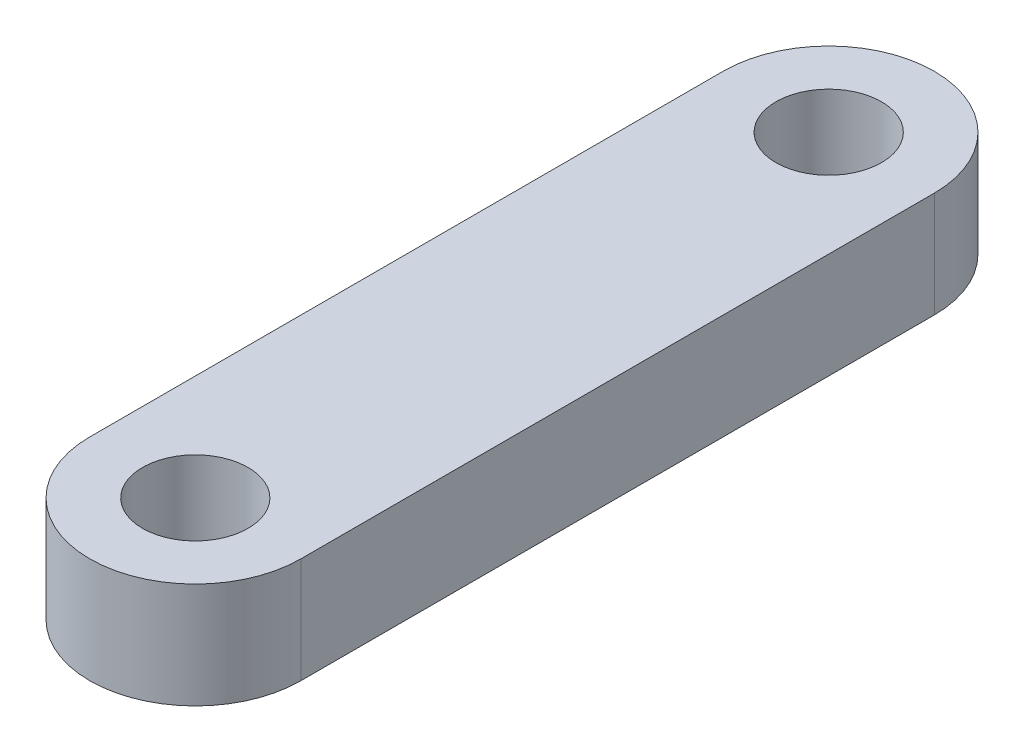
ISO-10303-21;
HEADER;
FILE_DESCRIPTION(('STEP AP214'),'2;1');
FILE_NAME('part.step','',(''),(''),'','','');
FILE_SCHEMA(('AUTOMOTIVE_DESIGN { 1 0 10303 214 1 1 1 1 }'));
ENDSEC;
DATA;
#1=APPLICATION_CONTEXT('core data for automotive mechanical design processes');
#2=APPLICATION_PROTOCOL_DEFINITION('international standard','automotive_design',2000,#1);
#3=PRODUCT_CONTEXT('',#1,'mechanical');
#4=PRODUCT('Part','Part','',(#3));
#5=PRODUCT_RELATED_PRODUCT_CATEGORY('part','',(#4));
#6=PRODUCT_DEFINITION_FORMATION('','',#4);
#7=PRODUCT_DEFINITION_CONTEXT('part definition',#1,'design');
#8=PRODUCT_DEFINITION('design','',#6,#7);
#9=PRODUCT_DEFINITION_SHAPE('','',#8);
#10=(LENGTH_UNIT() NAMED_UNIT(*) SI_UNIT(.MILLI.,.METRE.));
#11=(NAMED_UNIT(*) PLANE_ANGLE_UNIT() SI_UNIT($,.RADIAN.));
#12=(NAMED_UNIT(*) SI_UNIT($,.STERADIAN.) SOLID_ANGLE_UNIT());
#13=UNCERTAINTY_MEASURE_WITH_UNIT(LENGTH_MEASURE(1.E-05),#10,'distance_accuracy_value','');
#14=(GEOMETRIC_REPRESENTATION_CONTEXT(3) GLOBAL_UNCERTAINTY_ASSIGNED_CONTEXT((#13)) GLOBAL_UNIT_ASSIGNED_CONTEXT((#10,
#11,#12)) REPRESENTATION_CONTEXT('',''));
#15=CARTESIAN_POINT('',(0.,0.,0.));
#16=DIRECTION('',(0.,0.,1.));
#17=DIRECTION('',(1.,0.,0.));
#18=AXIS2_PLACEMENT_3D('',#15,#16,#17);
#19=CARTESIAN_POINT('',(0.,3.175,0.));
#20=DIRECTION('',(0.,1.,0.));
#21=DIRECTION('',(0.,0.,1.));
#22=AXIS2_PLACEMENT_3D('',#19,#20,#21);
#23=PLANE('',#22);
#24=CARTESIAN_POINT('',(0.,3.175,-19.05));
#25=DIRECTION('',(0.,1.,0.));
#26=DIRECTION('',(0.,0.,1.));
#27=AXIS2_PLACEMENT_3D('',#24,#25,#26);
#28=CIRCLE('',#27,1.5875);
#29=CARTESIAN_POINT('',(0.,3.175,-17.4625));
#30=VERTEX_POINT('',#29);
#31=EDGE_CURVE('E100',#30,#30,#28,.T.);
#32=ORIENTED_EDGE('',*,*,#31,.F.);
#33=EDGE_LOOP('',(#32));
#34=FACE_BOUND('',#33,.T.);
#35=CARTESIAN_POINT('',(0.,3.175,0.));
#36=DIRECTION('',(0.,1.,0.));
#37=DIRECTION('',(0.,0.,1.));
#38=AXIS2_PLACEMENT_3D('',#35,#36,#37);
#39=CIRCLE('',#38,3.175);
#40=CARTESIAN_POINT('',(-3.175,3.175,0.));
#41=VERTEX_POINT('',#40);
#42=CARTESIAN_POINT('',(3.175,3.175,0.));
#43=VERTEX_POINT('',#42);
#44=EDGE_CURVE('E85',#41,#43,#39,.T.);
#45=ORIENTED_EDGE('',*,*,#44,.T.);
#46=DIRECTION('',(0.,0.,-1.));
#47=VECTOR('',#46,1.);
#48=CARTESIAN_POINT('',(3.175,3.175,0.));
#49=LINE('',#48,#47);
#50=CARTESIAN_POINT('',(3.175,3.175,-19.05));
#51=VERTEX_POINT('',#50);
#52=EDGE_CURVE('E80',#43,#51,#49,.T.);
#53=ORIENTED_EDGE('',*,*,#52,.T.);
#54=CARTESIAN_POINT('',(0.,3.175,-19.05));
#55=DIRECTION('',(0.,1.,0.));
#56=DIRECTION('',(0.,0.,1.));
#57=AXIS2_PLACEMENT_3D('',#54,#55,#56);
#58=CIRCLE('',#57,3.175);
#59=CARTESIAN_POINT('',(-3.175,3.175,-19.05));
#60=VERTEX_POINT('',#59);
#61=EDGE_CURVE('E83',#51,#60,#58,.T.);
#62=ORIENTED_EDGE('',*,*,#61,.T.);
#63=DIRECTION('',(0.,0.,1.));
#64=VECTOR('',#63,1.);
#65=CARTESIAN_POINT('',(-3.175,3.175,0.));
#66=LINE('',#65,#64);
#67=EDGE_CURVE('E50',#60,#41,#66,.T.);
#68=ORIENTED_EDGE('',*,*,#67,.T.);
#69=EDGE_LOOP('',(#45,#53,#62,#68));
#70=FACE_BOUND('',#69,.T.);
#71=CARTESIAN_POINT('',(0.,3.175,0.));
#72=DIRECTION('',(0.,1.,0.));
#73=DIRECTION('',(0.,0.,1.));
#74=AXIS2_PLACEMENT_3D('',#71,#72,#73);
#75=CIRCLE('',#74,1.5875);
#76=CARTESIAN_POINT('',(0.,3.175,1.5875));
#77=VERTEX_POINT('',#76);
#78=EDGE_CURVE('E115',#77,#77,#75,.T.);
#79=ORIENTED_EDGE('',*,*,#78,.F.);
#80=EDGE_LOOP('',(#79));
#81=FACE_BOUND('',#80,.T.);
#82=ADVANCED_FACE('F33',(#34,#70,#81),#23,.T.);
#83=CARTESIAN_POINT('',(0.,0.,0.));
#84=DIRECTION('',(0.,1.,0.));
#85=DIRECTION('',(0.,0.,1.));
#86=AXIS2_PLACEMENT_3D('',#83,#84,#85);
#87=PLANE('',#86);
#88=CARTESIAN_POINT('',(0.,0.,-19.05));
#89=DIRECTION('',(0.,1.,0.));
#90=DIRECTION('',(0.,0.,1.));
#91=AXIS2_PLACEMENT_3D('',#88,#89,#90);
#92=CIRCLE('',#91,1.5875);
#93=CARTESIAN_POINT('',(0.,0.,-17.4625));
#94=VERTEX_POINT('',#93);
#95=EDGE_CURVE('E112',#94,#94,#92,.T.);
#96=ORIENTED_EDGE('',*,*,#95,.T.);
#97=EDGE_LOOP('',(#96));
#98=FACE_BOUND('',#97,.T.);
#99=CARTESIAN_POINT('',(0.,0.,0.));
#100=DIRECTION('',(0.,1.,0.));
#101=DIRECTION('',(0.,0.,1.));
#102=AXIS2_PLACEMENT_3D('',#99,#100,#101);
#103=CIRCLE('',#102,3.175);
#104=CARTESIAN_POINT('',(-3.175,0.,0.));
#105=VERTEX_POINT('',#104);
#106=CARTESIAN_POINT('',(3.175,0.,0.));
#107=VERTEX_POINT('',#106);
#108=EDGE_CURVE('E97',#105,#107,#103,.T.);
#109=ORIENTED_EDGE('',*,*,#108,.F.);
#110=DIRECTION('',(0.,0.,1.));
#111=VECTOR('',#110,1.);
#112=CARTESIAN_POINT('',(-3.175,0.,0.));
#113=LINE('',#112,#111);
#114=CARTESIAN_POINT('',(-3.175,0.,-19.05));
#115=VERTEX_POINT('',#114);
#116=EDGE_CURVE('E73',#115,#105,#113,.T.);
#117=ORIENTED_EDGE('',*,*,#116,.F.);
#118=CARTESIAN_POINT('',(0.,0.,-19.05));
#119=DIRECTION('',(0.,1.,0.));
#120=DIRECTION('',(0.,0.,1.));
#121=AXIS2_PLACEMENT_3D('',#118,#119,#120);
#122=CIRCLE('',#121,3.175);
#123=CARTESIAN_POINT('',(3.175,0.,-19.05));
#124=VERTEX_POINT('',#123);
#125=EDGE_CURVE('E67',#124,#115,#122,.T.);
#126=ORIENTED_EDGE('',*,*,#125,.F.);
#127=DIRECTION('',(0.,0.,-1.));
#128=VECTOR('',#127,1.);
#129=CARTESIAN_POINT('',(3.175,0.,0.));
#130=LINE('',#129,#128);
#131=EDGE_CURVE('E89',#107,#124,#130,.T.);
#132=ORIENTED_EDGE('',*,*,#131,.F.);
#133=EDGE_LOOP('',(#109,#117,#126,#132));
#134=FACE_BOUND('',#133,.T.);
#135=CARTESIAN_POINT('',(0.,0.,0.));
#136=DIRECTION('',(0.,1.,0.));
#137=DIRECTION('',(0.,0.,1.));
#138=AXIS2_PLACEMENT_3D('',#135,#136,#137);
#139=CIRCLE('',#138,1.5875);
#140=CARTESIAN_POINT('',(0.,0.,1.5875));
#141=VERTEX_POINT('',#140);
#142=EDGE_CURVE('E118',#141,#141,#139,.T.);
#143=ORIENTED_EDGE('',*,*,#142,.T.);
#144=EDGE_LOOP('',(#143));
#145=FACE_BOUND('',#144,.T.);
#146=ADVANCED_FACE('F108',(#98,#134,#145),#87,.F.);
#147=CARTESIAN_POINT('',(0.,3.175,0.));
#148=DIRECTION('',(0.,-1.,0.));
#149=DIRECTION('',(0.,0.,-1.));
#150=AXIS2_PLACEMENT_3D('',#147,#148,#149);
#151=CYLINDRICAL_SURFACE('',#150,3.175);
#152=ORIENTED_EDGE('',*,*,#108,.T.);
#153=DIRECTION('',(0.,-1.,0.));
#154=VECTOR('',#153,1.);
#155=CARTESIAN_POINT('',(3.175,3.175,0.));
#156=LINE('',#155,#154);
#157=EDGE_CURVE('E11',#43,#107,#156,.T.);
#158=ORIENTED_EDGE('',*,*,#157,.F.);
#159=ORIENTED_EDGE('',*,*,#44,.F.);
#160=DIRECTION('',(0.,-1.,0.));
#161=VECTOR('',#160,1.);
#162=CARTESIAN_POINT('',(-3.175,3.175,0.));
#163=LINE('',#162,#161);
#164=EDGE_CURVE('E93',#41,#105,#163,.T.);
#165=ORIENTED_EDGE('',*,*,#164,.T.);
#166=EDGE_LOOP('',(#152,#158,#159,#165));
#167=FACE_BOUND('',#166,.T.);
#168=ADVANCED_FACE('F35',(#167),#151,.T.);
#169=CARTESIAN_POINT('',(3.175,3.175,0.));
#170=DIRECTION('',(-1.,0.,0.));
#171=DIRECTION('',(0.,0.,1.));
#172=AXIS2_PLACEMENT_3D('',#169,#170,#171);
#173=PLANE('',#172);
#174=ORIENTED_EDGE('',*,*,#131,.T.);
#175=DIRECTION('',(0.,-1.,0.));
#176=VECTOR('',#175,1.);
#177=CARTESIAN_POINT('',(3.175,3.175,-19.05));
#178=LINE('',#177,#176);
#179=EDGE_CURVE('E42',#51,#124,#178,.T.);
#180=ORIENTED_EDGE('',*,*,#179,.F.);
#181=ORIENTED_EDGE('',*,*,#52,.F.);
#182=ORIENTED_EDGE('',*,*,#157,.T.);
#183=EDGE_LOOP('',(#174,#180,#181,#182));
#184=FACE_BOUND('',#183,.T.);
#185=ADVANCED_FACE('F88',(#184),#173,.F.);
#186=CARTESIAN_POINT('',(0.,3.175,-19.05));
#187=DIRECTION('',(0.,-1.,0.));
#188=DIRECTION('',(0.,0.,-1.));
#189=AXIS2_PLACEMENT_3D('',#186,#187,#188);
#190=CYLINDRICAL_SURFACE('',#189,3.175);
#191=ORIENTED_EDGE('',*,*,#125,.T.);
#192=DIRECTION('',(0.,-1.,0.));
#193=VECTOR('',#192,1.);
#194=CARTESIAN_POINT('',(-3.175,3.175,-19.05));
#195=LINE('',#194,#193);
#196=EDGE_CURVE('E90',#60,#115,#195,.T.);
#197=ORIENTED_EDGE('',*,*,#196,.F.);
#198=ORIENTED_EDGE('',*,*,#61,.F.);
#199=ORIENTED_EDGE('',*,*,#179,.T.);
#200=EDGE_LOOP('',(#191,#197,#198,#199));
#201=FACE_BOUND('',#200,.T.);
#202=ADVANCED_FACE('F91',(#201),#190,.T.);
#203=CARTESIAN_POINT('',(-3.175,3.175,0.));
#204=DIRECTION('',(1.,0.,0.));
#205=DIRECTION('',(0.,0.,-1.));
#206=AXIS2_PLACEMENT_3D('',#203,#204,#205);
#207=PLANE('',#206);
#208=ORIENTED_EDGE('',*,*,#116,.T.);
#209=ORIENTED_EDGE('',*,*,#164,.F.);
#210=ORIENTED_EDGE('',*,*,#67,.F.);
#211=ORIENTED_EDGE('',*,*,#196,.T.);
#212=EDGE_LOOP('',(#208,#209,#210,#211));
#213=FACE_BOUND('',#212,.T.);
#214=ADVANCED_FACE('F105',(#213),#207,.F.);
#215=CARTESIAN_POINT('',(0.,3.175,-19.05));
#216=DIRECTION('',(0.,-1.,0.));
#217=DIRECTION('',(0.,0.,-1.));
#218=AXIS2_PLACEMENT_3D('',#215,#216,#217);
#219=CYLINDRICAL_SURFACE('',#218,1.5875);
#220=ORIENTED_EDGE('',*,*,#31,.T.);
#221=EDGE_LOOP('',(#220));
#222=FACE_BOUND('',#221,.T.);
#223=ORIENTED_EDGE('',*,*,#95,.F.);
#224=EDGE_LOOP('',(#223));
#225=FACE_BOUND('',#224,.T.);
#226=ADVANCED_FACE('F136',(#222,#225),#219,.F.);
#227=CARTESIAN_POINT('',(0.,3.175,0.));
#228=DIRECTION('',(0.,-1.,0.));
#229=DIRECTION('',(0.,0.,-1.));
#230=AXIS2_PLACEMENT_3D('',#227,#228,#229);
#231=CYLINDRICAL_SURFACE('',#230,1.5875);
#232=ORIENTED_EDGE('',*,*,#78,.T.);
#233=EDGE_LOOP('',(#232));
#234=FACE_BOUND('',#233,.T.);
#235=ORIENTED_EDGE('',*,*,#142,.F.);
#236=EDGE_LOOP('',(#235));
#237=FACE_BOUND('',#236,.T.);
#238=ADVANCED_FACE('F124',(#234,#237),#231,.F.);
#239=CLOSED_SHELL('',(#82,#146,#168,#185,#202,#214,#226,#238));
#240=MANIFOLD_SOLID_BREP('B2',#239);
#241=ADVANCED_BREP_SHAPE_REPRESENTATION('',(#18,#240),#14);
#242=SHAPE_DEFINITION_REPRESENTATION(#9,#241);
ENDSEC;
END-ISO-10303-21;
